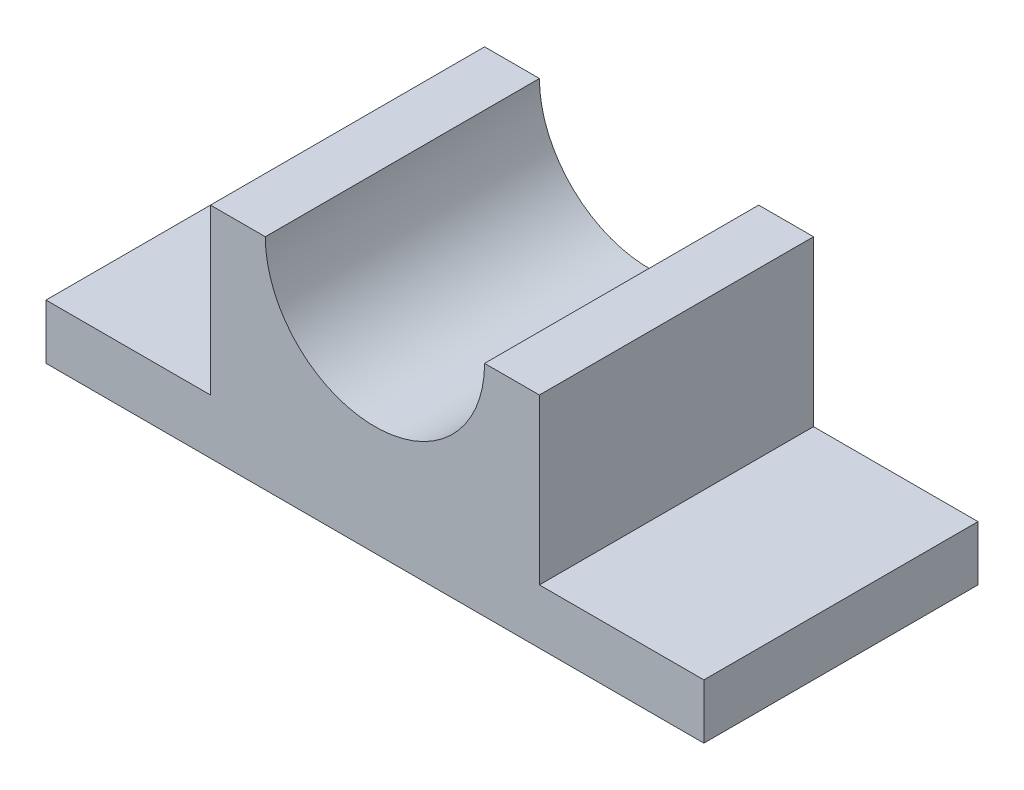
ISO-10303-21;
HEADER;
FILE_DESCRIPTION(('STEP AP214'),'2;1');
FILE_NAME('part.step','',(''),(''),'','','');
FILE_SCHEMA(('AUTOMOTIVE_DESIGN { 1 0 10303 214 1 1 1 1 }'));
ENDSEC;
DATA;
#1=APPLICATION_CONTEXT('core data for automotive mechanical design processes');
#2=APPLICATION_PROTOCOL_DEFINITION('international standard','automotive_design',2000,#1);
#3=PRODUCT_CONTEXT('',#1,'mechanical');
#4=PRODUCT('Part','Part','',(#3));
#5=PRODUCT_RELATED_PRODUCT_CATEGORY('part','',(#4));
#6=PRODUCT_DEFINITION_FORMATION('','',#4);
#7=PRODUCT_DEFINITION_CONTEXT('part definition',#1,'design');
#8=PRODUCT_DEFINITION('design','',#6,#7);
#9=PRODUCT_DEFINITION_SHAPE('','',#8);
#10=(LENGTH_UNIT() NAMED_UNIT(*) SI_UNIT(.MILLI.,.METRE.));
#11=(NAMED_UNIT(*) PLANE_ANGLE_UNIT() SI_UNIT($,.RADIAN.));
#12=(NAMED_UNIT(*) SI_UNIT($,.STERADIAN.) SOLID_ANGLE_UNIT());
#13=UNCERTAINTY_MEASURE_WITH_UNIT(LENGTH_MEASURE(1.E-05),#10,'distance_accuracy_value','');
#14=(GEOMETRIC_REPRESENTATION_CONTEXT(3) GLOBAL_UNCERTAINTY_ASSIGNED_CONTEXT((#13)) GLOBAL_UNIT_ASSIGNED_CONTEXT((#10,
#11,#12)) REPRESENTATION_CONTEXT('',''));
#15=CARTESIAN_POINT('',(0.,0.,0.));
#16=DIRECTION('',(0.,0.,1.));
#17=DIRECTION('',(1.,0.,0.));
#18=AXIS2_PLACEMENT_3D('',#15,#16,#17);
#19=CARTESIAN_POINT('',(0.,50.8,31.75));
#20=DIRECTION('',(0.,0.,-1.));
#21=DIRECTION('',(-1.,0.,0.));
#22=AXIS2_PLACEMENT_3D('',#19,#20,#21);
#23=CYLINDRICAL_SURFACE('',#22,25.4);
#24=CARTESIAN_POINT('',(0.,50.8,-31.75));
#25=DIRECTION('',(0.,0.,-1.));
#26=DIRECTION('',(-1.,0.,0.));
#27=AXIS2_PLACEMENT_3D('',#24,#25,#26);
#28=CIRCLE('',#27,25.4);
#29=CARTESIAN_POINT('',(25.4,50.8,-31.75));
#30=VERTEX_POINT('',#29);
#31=CARTESIAN_POINT('',(-25.4,50.8,-31.75));
#32=VERTEX_POINT('',#31);
#33=EDGE_CURVE('E145',#30,#32,#28,.T.);
#34=ORIENTED_EDGE('',*,*,#33,.T.);
#35=DIRECTION('',(0.,0.,-1.));
#36=VECTOR('',#35,1.);
#37=CARTESIAN_POINT('',(-25.4,50.8,31.75));
#38=LINE('',#37,#36);
#39=CARTESIAN_POINT('',(-25.4,50.8,31.75));
#40=VERTEX_POINT('',#39);
#41=EDGE_CURVE('E11',#40,#32,#38,.T.);
#42=ORIENTED_EDGE('',*,*,#41,.F.);
#43=CARTESIAN_POINT('',(0.,50.8,31.75));
#44=DIRECTION('',(0.,0.,-1.));
#45=DIRECTION('',(-1.,0.,0.));
#46=AXIS2_PLACEMENT_3D('',#43,#44,#45);
#47=CIRCLE('',#46,25.4);
#48=CARTESIAN_POINT('',(25.4,50.8,31.75));
#49=VERTEX_POINT('',#48);
#50=EDGE_CURVE('E163',#49,#40,#47,.T.);
#51=ORIENTED_EDGE('',*,*,#50,.F.);
#52=DIRECTION('',(0.,0.,-1.));
#53=VECTOR('',#52,1.);
#54=CARTESIAN_POINT('',(25.4,50.8,31.75));
#55=LINE('',#54,#53);
#56=EDGE_CURVE('E141',#49,#30,#55,.T.);
#57=ORIENTED_EDGE('',*,*,#56,.T.);
#58=EDGE_LOOP('',(#34,#42,#51,#57));
#59=FACE_BOUND('',#58,.T.);
#60=ADVANCED_FACE('F37',(#59),#23,.F.);
#61=CARTESIAN_POINT('',(-25.4,50.8,31.75));
#62=DIRECTION('',(0.,-1.,0.));
#63=DIRECTION('',(1.,0.,0.));
#64=AXIS2_PLACEMENT_3D('',#61,#62,#63);
#65=PLANE('',#64);
#66=DIRECTION('',(-1.,0.,0.));
#67=VECTOR('',#66,1.);
#68=CARTESIAN_POINT('',(-25.4,50.8,-31.75));
#69=LINE('',#68,#67);
#70=CARTESIAN_POINT('',(-38.1,50.8,-31.75));
#71=VERTEX_POINT('',#70);
#72=EDGE_CURVE('E148',#32,#71,#69,.T.);
#73=ORIENTED_EDGE('',*,*,#72,.T.);
#74=DIRECTION('',(0.,0.,-1.));
#75=VECTOR('',#74,1.);
#76=CARTESIAN_POINT('',(-38.1,50.8,31.75));
#77=LINE('',#76,#75);
#78=CARTESIAN_POINT('',(-38.1,50.8,31.75));
#79=VERTEX_POINT('',#78);
#80=EDGE_CURVE('E45',#79,#71,#77,.T.);
#81=ORIENTED_EDGE('',*,*,#80,.F.);
#82=DIRECTION('',(-1.,0.,0.));
#83=VECTOR('',#82,1.);
#84=CARTESIAN_POINT('',(-25.4,50.8,31.75));
#85=LINE('',#84,#83);
#86=EDGE_CURVE('E102',#40,#79,#85,.T.);
#87=ORIENTED_EDGE('',*,*,#86,.F.);
#88=ORIENTED_EDGE('',*,*,#41,.T.);
#89=EDGE_LOOP('',(#73,#81,#87,#88));
#90=FACE_BOUND('',#89,.T.);
#91=ADVANCED_FACE('F212',(#90),#65,.F.);
#92=CARTESIAN_POINT('',(-38.1,50.8,31.75));
#93=DIRECTION('',(1.,0.,0.));
#94=DIRECTION('',(0.,0.,-1.));
#95=AXIS2_PLACEMENT_3D('',#92,#93,#94);
#96=PLANE('',#95);
#97=DIRECTION('',(0.,-1.,0.));
#98=VECTOR('',#97,1.);
#99=CARTESIAN_POINT('',(-38.1,50.8,-31.75));
#100=LINE('',#99,#98);
#101=CARTESIAN_POINT('',(-38.1,12.7,-31.75));
#102=VERTEX_POINT('',#101);
#103=EDGE_CURVE('E150',#71,#102,#100,.T.);
#104=ORIENTED_EDGE('',*,*,#103,.T.);
#105=DIRECTION('',(0.,0.,-1.));
#106=VECTOR('',#105,1.);
#107=CARTESIAN_POINT('',(-38.1,12.7,31.75));
#108=LINE('',#107,#106);
#109=CARTESIAN_POINT('',(-38.1,12.7,31.75));
#110=VERTEX_POINT('',#109);
#111=EDGE_CURVE('E176',#110,#102,#108,.T.);
#112=ORIENTED_EDGE('',*,*,#111,.F.);
#113=DIRECTION('',(0.,-1.,0.));
#114=VECTOR('',#113,1.);
#115=CARTESIAN_POINT('',(-38.1,50.8,31.75));
#116=LINE('',#115,#114);
#117=EDGE_CURVE('E184',#79,#110,#116,.T.);
#118=ORIENTED_EDGE('',*,*,#117,.F.);
#119=ORIENTED_EDGE('',*,*,#80,.T.);
#120=EDGE_LOOP('',(#104,#112,#118,#119));
#121=FACE_BOUND('',#120,.T.);
#122=ADVANCED_FACE('F182',(#121),#96,.F.);
#123=CARTESIAN_POINT('',(-38.1,12.7,31.75));
#124=DIRECTION('',(0.,-1.,0.));
#125=DIRECTION('',(1.,0.,0.));
#126=AXIS2_PLACEMENT_3D('',#123,#124,#125);
#127=PLANE('',#126);
#128=DIRECTION('',(-1.,0.,0.));
#129=VECTOR('',#128,1.);
#130=CARTESIAN_POINT('',(-38.1,12.7,-31.75));
#131=LINE('',#130,#129);
#132=CARTESIAN_POINT('',(-76.2,12.7,-31.75));
#133=VERTEX_POINT('',#132);
#134=EDGE_CURVE('E152',#102,#133,#131,.T.);
#135=ORIENTED_EDGE('',*,*,#134,.T.);
#136=DIRECTION('',(0.,0.,-1.));
#137=VECTOR('',#136,1.);
#138=CARTESIAN_POINT('',(-76.2,12.7,31.75));
#139=LINE('',#138,#137);
#140=CARTESIAN_POINT('',(-76.2,12.7,31.75));
#141=VERTEX_POINT('',#140);
#142=EDGE_CURVE('E173',#141,#133,#139,.T.);
#143=ORIENTED_EDGE('',*,*,#142,.F.);
#144=DIRECTION('',(-1.,0.,0.));
#145=VECTOR('',#144,1.);
#146=CARTESIAN_POINT('',(-38.1,12.7,31.75));
#147=LINE('',#146,#145);
#148=EDGE_CURVE('E202',#110,#141,#147,.T.);
#149=ORIENTED_EDGE('',*,*,#148,.F.);
#150=ORIENTED_EDGE('',*,*,#111,.T.);
#151=EDGE_LOOP('',(#135,#143,#149,#150));
#152=FACE_BOUND('',#151,.T.);
#153=ADVANCED_FACE('F193',(#152),#127,.F.);
#154=CARTESIAN_POINT('',(-76.2,12.7,31.75));
#155=DIRECTION('',(1.,0.,0.));
#156=DIRECTION('',(0.,1.,0.));
#157=AXIS2_PLACEMENT_3D('',#154,#155,#156);
#158=PLANE('',#157);
#159=DIRECTION('',(0.,-1.,0.));
#160=VECTOR('',#159,1.);
#161=CARTESIAN_POINT('',(-76.2,12.7,-31.75));
#162=LINE('',#161,#160);
#163=CARTESIAN_POINT('',(-76.2,0.,-31.75));
#164=VERTEX_POINT('',#163);
#165=EDGE_CURVE('E154',#133,#164,#162,.T.);
#166=ORIENTED_EDGE('',*,*,#165,.T.);
#167=DIRECTION('',(0.,0.,-1.));
#168=VECTOR('',#167,1.);
#169=CARTESIAN_POINT('',(-76.2,0.,31.75));
#170=LINE('',#169,#168);
#171=CARTESIAN_POINT('',(-76.2,0.,31.75));
#172=VERTEX_POINT('',#171);
#173=EDGE_CURVE('E170',#172,#164,#170,.T.);
#174=ORIENTED_EDGE('',*,*,#173,.F.);
#175=DIRECTION('',(0.,-1.,0.));
#176=VECTOR('',#175,1.);
#177=CARTESIAN_POINT('',(-76.2,12.7,31.75));
#178=LINE('',#177,#176);
#179=EDGE_CURVE('E199',#141,#172,#178,.T.);
#180=ORIENTED_EDGE('',*,*,#179,.F.);
#181=ORIENTED_EDGE('',*,*,#142,.T.);
#182=EDGE_LOOP('',(#166,#174,#180,#181));
#183=FACE_BOUND('',#182,.T.);
#184=ADVANCED_FACE('F197',(#183),#158,.F.);
#185=CARTESIAN_POINT('',(-76.2,0.,31.75));
#186=DIRECTION('',(0.,1.,0.));
#187=DIRECTION('',(0.,0.,1.));
#188=AXIS2_PLACEMENT_3D('',#185,#186,#187);
#189=PLANE('',#188);
#190=DIRECTION('',(1.,0.,0.));
#191=VECTOR('',#190,1.);
#192=CARTESIAN_POINT('',(-76.2,0.,-31.75));
#193=LINE('',#192,#191);
#194=CARTESIAN_POINT('',(76.2,0.,-31.75));
#195=VERTEX_POINT('',#194);
#196=EDGE_CURVE('E156',#164,#195,#193,.T.);
#197=ORIENTED_EDGE('',*,*,#196,.T.);
#198=DIRECTION('',(0.,0.,-1.));
#199=VECTOR('',#198,1.);
#200=CARTESIAN_POINT('',(76.2,0.,31.75));
#201=LINE('',#200,#199);
#202=CARTESIAN_POINT('',(76.2,0.,31.75));
#203=VERTEX_POINT('',#202);
#204=EDGE_CURVE('E167',#203,#195,#201,.T.);
#205=ORIENTED_EDGE('',*,*,#204,.F.);
#206=DIRECTION('',(1.,0.,0.));
#207=VECTOR('',#206,1.);
#208=CARTESIAN_POINT('',(-76.2,0.,31.75));
#209=LINE('',#208,#207);
#210=EDGE_CURVE('E201',#172,#203,#209,.T.);
#211=ORIENTED_EDGE('',*,*,#210,.F.);
#212=ORIENTED_EDGE('',*,*,#173,.T.);
#213=EDGE_LOOP('',(#197,#205,#211,#212));
#214=FACE_BOUND('',#213,.T.);
#215=ADVANCED_FACE('F224',(#214),#189,.F.);
#216=CARTESIAN_POINT('',(76.2,12.7,31.75));
#217=DIRECTION('',(-1.,0.,0.));
#218=DIRECTION('',(0.,-1.,0.));
#219=AXIS2_PLACEMENT_3D('',#216,#217,#218);
#220=PLANE('',#219);
#221=DIRECTION('',(0.,1.,0.));
#222=VECTOR('',#221,1.);
#223=CARTESIAN_POINT('',(76.2,12.7,-31.75));
#224=LINE('',#223,#222);
#225=CARTESIAN_POINT('',(76.2,12.7,-31.75));
#226=VERTEX_POINT('',#225);
#227=EDGE_CURVE('E158',#195,#226,#224,.T.);
#228=ORIENTED_EDGE('',*,*,#227,.T.);
#229=DIRECTION('',(0.,0.,-1.));
#230=VECTOR('',#229,1.);
#231=CARTESIAN_POINT('',(76.2,12.7,31.75));
#232=LINE('',#231,#230);
#233=CARTESIAN_POINT('',(76.2,12.7,31.75));
#234=VERTEX_POINT('',#233);
#235=EDGE_CURVE('E136',#234,#226,#232,.T.);
#236=ORIENTED_EDGE('',*,*,#235,.F.);
#237=DIRECTION('',(0.,1.,0.));
#238=VECTOR('',#237,1.);
#239=CARTESIAN_POINT('',(76.2,12.7,31.75));
#240=LINE('',#239,#238);
#241=EDGE_CURVE('E127',#203,#234,#240,.T.);
#242=ORIENTED_EDGE('',*,*,#241,.F.);
#243=ORIENTED_EDGE('',*,*,#204,.T.);
#244=EDGE_LOOP('',(#228,#236,#242,#243));
#245=FACE_BOUND('',#244,.T.);
#246=ADVANCED_FACE('F227',(#245),#220,.F.);
#247=CARTESIAN_POINT('',(38.1,12.7,31.75));
#248=DIRECTION('',(0.,-1.,0.));
#249=DIRECTION('',(1.,0.,0.));
#250=AXIS2_PLACEMENT_3D('',#247,#248,#249);
#251=PLANE('',#250);
#252=DIRECTION('',(-1.,0.,0.));
#253=VECTOR('',#252,1.);
#254=CARTESIAN_POINT('',(38.1,12.7,-31.75));
#255=LINE('',#254,#253);
#256=CARTESIAN_POINT('',(38.1,12.7,-31.75));
#257=VERTEX_POINT('',#256);
#258=EDGE_CURVE('E135',#226,#257,#255,.T.);
#259=ORIENTED_EDGE('',*,*,#258,.T.);
#260=DIRECTION('',(0.,0.,-1.));
#261=VECTOR('',#260,1.);
#262=CARTESIAN_POINT('',(38.1,12.7,31.75));
#263=LINE('',#262,#261);
#264=CARTESIAN_POINT('',(38.1,12.7,31.75));
#265=VERTEX_POINT('',#264);
#266=EDGE_CURVE('E132',#265,#257,#263,.T.);
#267=ORIENTED_EDGE('',*,*,#266,.F.);
#268=DIRECTION('',(-1.,0.,0.));
#269=VECTOR('',#268,1.);
#270=CARTESIAN_POINT('',(38.1,12.7,31.75));
#271=LINE('',#270,#269);
#272=EDGE_CURVE('E121',#234,#265,#271,.T.);
#273=ORIENTED_EDGE('',*,*,#272,.F.);
#274=ORIENTED_EDGE('',*,*,#235,.T.);
#275=EDGE_LOOP('',(#259,#267,#273,#274));
#276=FACE_BOUND('',#275,.T.);
#277=ADVANCED_FACE('F133',(#276),#251,.F.);
#278=CARTESIAN_POINT('',(38.1,50.8,31.75));
#279=DIRECTION('',(-1.,0.,0.));
#280=DIRECTION('',(0.,0.,1.));
#281=AXIS2_PLACEMENT_3D('',#278,#279,#280);
#282=PLANE('',#281);
#283=DIRECTION('',(0.,1.,0.));
#284=VECTOR('',#283,1.);
#285=CARTESIAN_POINT('',(38.1,50.8,-31.75));
#286=LINE('',#285,#284);
#287=CARTESIAN_POINT('',(38.1,50.8,-31.75));
#288=VERTEX_POINT('',#287);
#289=EDGE_CURVE('E88',#257,#288,#286,.T.);
#290=ORIENTED_EDGE('',*,*,#289,.T.);
#291=DIRECTION('',(0.,0.,-1.));
#292=VECTOR('',#291,1.);
#293=CARTESIAN_POINT('',(38.1,50.8,31.75));
#294=LINE('',#293,#292);
#295=CARTESIAN_POINT('',(38.1,50.8,31.75));
#296=VERTEX_POINT('',#295);
#297=EDGE_CURVE('E137',#296,#288,#294,.T.);
#298=ORIENTED_EDGE('',*,*,#297,.F.);
#299=DIRECTION('',(0.,1.,0.));
#300=VECTOR('',#299,1.);
#301=CARTESIAN_POINT('',(38.1,50.8,31.75));
#302=LINE('',#301,#300);
#303=EDGE_CURVE('E125',#265,#296,#302,.T.);
#304=ORIENTED_EDGE('',*,*,#303,.F.);
#305=ORIENTED_EDGE('',*,*,#266,.T.);
#306=EDGE_LOOP('',(#290,#298,#304,#305));
#307=FACE_BOUND('',#306,.T.);
#308=ADVANCED_FACE('F139',(#307),#282,.F.);
#309=CARTESIAN_POINT('',(25.4,50.8,31.75));
#310=DIRECTION('',(0.,-1.,0.));
#311=DIRECTION('',(1.,0.,0.));
#312=AXIS2_PLACEMENT_3D('',#309,#310,#311);
#313=PLANE('',#312);
#314=DIRECTION('',(-1.,0.,0.));
#315=VECTOR('',#314,1.);
#316=CARTESIAN_POINT('',(25.4,50.8,-31.75));
#317=LINE('',#316,#315);
#318=EDGE_CURVE('E94',#288,#30,#317,.T.);
#319=ORIENTED_EDGE('',*,*,#318,.T.);
#320=ORIENTED_EDGE('',*,*,#56,.F.);
#321=DIRECTION('',(-1.,0.,0.));
#322=VECTOR('',#321,1.);
#323=CARTESIAN_POINT('',(25.4,50.8,31.75));
#324=LINE('',#323,#322);
#325=EDGE_CURVE('E53',#296,#49,#324,.T.);
#326=ORIENTED_EDGE('',*,*,#325,.F.);
#327=ORIENTED_EDGE('',*,*,#297,.T.);
#328=EDGE_LOOP('',(#319,#320,#326,#327));
#329=FACE_BOUND('',#328,.T.);
#330=ADVANCED_FACE('F236',(#329),#313,.F.);
#331=CARTESIAN_POINT('',(0.,50.8,31.75));
#332=DIRECTION('',(0.,0.,-1.));
#333=DIRECTION('',(-1.,0.,0.));
#334=AXIS2_PLACEMENT_3D('',#331,#332,#333);
#335=PLANE('',#334);
#336=ORIENTED_EDGE('',*,*,#50,.T.);
#337=ORIENTED_EDGE('',*,*,#86,.T.);
#338=ORIENTED_EDGE('',*,*,#117,.T.);
#339=ORIENTED_EDGE('',*,*,#148,.T.);
#340=ORIENTED_EDGE('',*,*,#179,.T.);
#341=ORIENTED_EDGE('',*,*,#210,.T.);
#342=ORIENTED_EDGE('',*,*,#241,.T.);
#343=ORIENTED_EDGE('',*,*,#272,.T.);
#344=ORIENTED_EDGE('',*,*,#303,.T.);
#345=ORIENTED_EDGE('',*,*,#325,.T.);
#346=EDGE_LOOP('',(#336,#337,#338,#339,#340,#341,#342,#343,#344,#345));
#347=FACE_BOUND('',#346,.T.);
#348=ADVANCED_FACE('F123',(#347),#335,.F.);
#349=CARTESIAN_POINT('',(0.,50.8,-31.75));
#350=DIRECTION('',(0.,0.,-1.));
#351=DIRECTION('',(-1.,0.,0.));
#352=AXIS2_PLACEMENT_3D('',#349,#350,#351);
#353=PLANE('',#352);
#354=ORIENTED_EDGE('',*,*,#33,.F.);
#355=ORIENTED_EDGE('',*,*,#318,.F.);
#356=ORIENTED_EDGE('',*,*,#289,.F.);
#357=ORIENTED_EDGE('',*,*,#258,.F.);
#358=ORIENTED_EDGE('',*,*,#227,.F.);
#359=ORIENTED_EDGE('',*,*,#196,.F.);
#360=ORIENTED_EDGE('',*,*,#165,.F.);
#361=ORIENTED_EDGE('',*,*,#134,.F.);
#362=ORIENTED_EDGE('',*,*,#103,.F.);
#363=ORIENTED_EDGE('',*,*,#72,.F.);
#364=EDGE_LOOP('',(#354,#355,#356,#357,#358,#359,#360,#361,#362,#363));
#365=FACE_BOUND('',#364,.T.);
#366=ADVANCED_FACE('F188',(#365),#353,.T.);
#367=CLOSED_SHELL('',(#60,#91,#122,#153,#184,#215,#246,#277,#308,#330,#348,#366));
#368=MANIFOLD_SOLID_BREP('B2',#367);
#369=ADVANCED_BREP_SHAPE_REPRESENTATION('',(#18,#368),#14);
#370=SHAPE_DEFINITION_REPRESENTATION(#9,#369);
ENDSEC;
END-ISO-10303-21;
